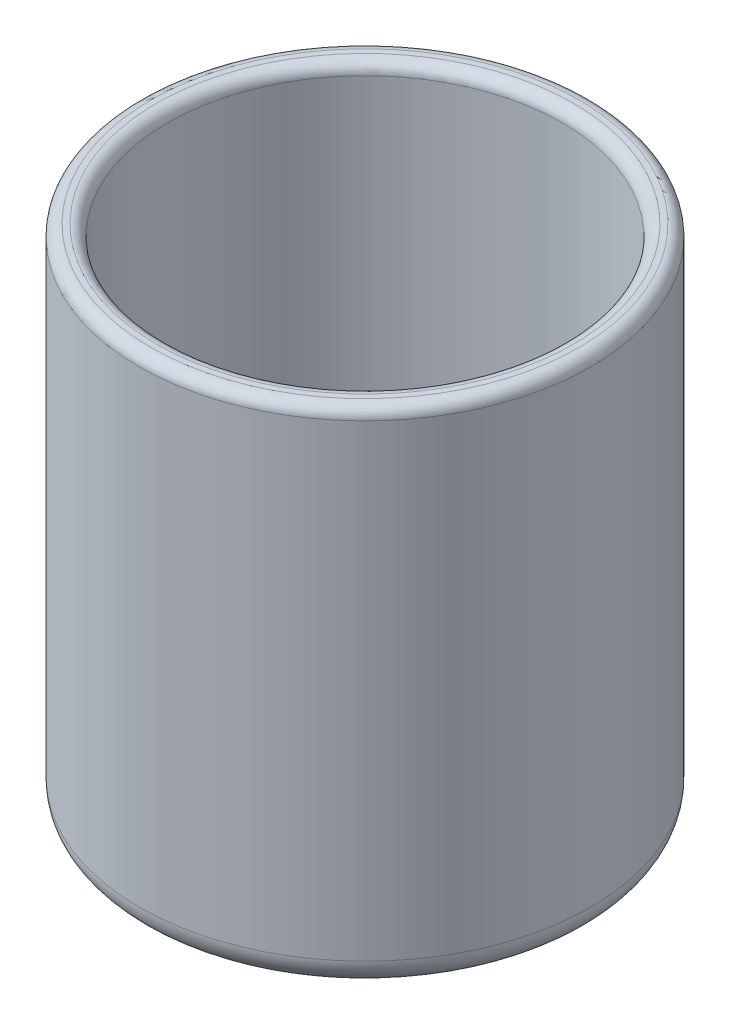
ISO-10303-21;
HEADER;
FILE_DESCRIPTION(('STEP AP214'),'2;1');
FILE_NAME('part.step','',(''),(''),'','','');
FILE_SCHEMA(('AUTOMOTIVE_DESIGN { 1 0 10303 214 1 1 1 1 }'));
ENDSEC;
DATA;
#1=APPLICATION_CONTEXT('core data for automotive mechanical design processes');
#2=APPLICATION_PROTOCOL_DEFINITION('international standard','automotive_design',2000,#1);
#3=PRODUCT_CONTEXT('',#1,'mechanical');
#4=PRODUCT('Part','Part','',(#3));
#5=PRODUCT_RELATED_PRODUCT_CATEGORY('part','',(#4));
#6=PRODUCT_DEFINITION_FORMATION('','',#4);
#7=PRODUCT_DEFINITION_CONTEXT('part definition',#1,'design');
#8=PRODUCT_DEFINITION('design','',#6,#7);
#9=PRODUCT_DEFINITION_SHAPE('','',#8);
#10=(LENGTH_UNIT() NAMED_UNIT(*) SI_UNIT(.MILLI.,.METRE.));
#11=(NAMED_UNIT(*) PLANE_ANGLE_UNIT() SI_UNIT($,.RADIAN.));
#12=(NAMED_UNIT(*) SI_UNIT($,.STERADIAN.) SOLID_ANGLE_UNIT());
#13=UNCERTAINTY_MEASURE_WITH_UNIT(LENGTH_MEASURE(1.E-05),#10,'distance_accuracy_value','');
#14=(GEOMETRIC_REPRESENTATION_CONTEXT(3) GLOBAL_UNCERTAINTY_ASSIGNED_CONTEXT((#13)) GLOBAL_UNIT_ASSIGNED_CONTEXT((#10,
#11,#12)) REPRESENTATION_CONTEXT('',''));
#15=CARTESIAN_POINT('',(0.,0.,0.));
#16=DIRECTION('',(0.,0.,1.));
#17=DIRECTION('',(1.,0.,0.));
#18=AXIS2_PLACEMENT_3D('',#15,#16,#17);
#19=CARTESIAN_POINT('',(0.,90.,0.));
#20=DIRECTION('',(0.,-1.,0.));
#21=DIRECTION('',(0.,0.,-1.));
#22=AXIS2_PLACEMENT_3D('',#19,#20,#21);
#23=CYLINDRICAL_SURFACE('',#22,40.);
#24=CARTESIAN_POINT('',(0.,5.,0.));
#25=DIRECTION('',(0.,1.,0.));
#26=DIRECTION('',(0.,0.,1.));
#27=AXIS2_PLACEMENT_3D('',#24,#25,#26);
#28=CIRCLE('',#27,40.);
#29=CARTESIAN_POINT('',(0.,4.99999999999999,-40.));
#30=VERTEX_POINT('',#29);
#31=EDGE_CURVE('E39',#30,#30,#28,.T.);
#32=CARTESIAN_POINT('',(0.,88.,0.));
#33=DIRECTION('',(0.,1.,0.));
#34=DIRECTION('',(0.,0.,1.));
#35=AXIS2_PLACEMENT_3D('',#32,#33,#34);
#36=CIRCLE('',#35,40.);
#37=CARTESIAN_POINT('',(0.,88.,-40.));
#38=VERTEX_POINT('',#37);
#39=EDGE_CURVE('E55',#38,#38,#36,.F.);
#40=CARTESIAN_POINT('',(0.,4.99999999999999,-40.));
#41=CARTESIAN_POINT('',(0.,5.86458333333333,-40.));
#42=CARTESIAN_POINT('',(0.,6.72916666666666,-40.));
#43=CARTESIAN_POINT('',(0.,8.45833333333333,-40.));
#44=CARTESIAN_POINT('',(0.,9.32291666666666,-40.));
#45=CARTESIAN_POINT('',(0.,11.0520833333333,-40.));
#46=CARTESIAN_POINT('',(0.,11.9166666666667,-40.));
#47=CARTESIAN_POINT('',(0.,13.6458333333333,-40.));
#48=CARTESIAN_POINT('',(0.,14.5104166666667,-40.));
#49=CARTESIAN_POINT('',(0.,16.2395833333333,-40.));
#50=CARTESIAN_POINT('',(0.,17.1041666666667,-40.));
#51=CARTESIAN_POINT('',(0.,18.8333333333333,-40.));
#52=CARTESIAN_POINT('',(0.,19.6979166666667,-40.));
#53=CARTESIAN_POINT('',(0.,21.4270833333333,-40.));
#54=CARTESIAN_POINT('',(0.,22.2916666666667,-40.));
#55=CARTESIAN_POINT('',(0.,24.0208333333333,-40.));
#56=CARTESIAN_POINT('',(0.,24.8854166666667,-40.));
#57=CARTESIAN_POINT('',(0.,26.6145833333333,-40.));
#58=CARTESIAN_POINT('',(0.,27.4791666666667,-40.));
#59=CARTESIAN_POINT('',(0.,29.2083333333333,-40.));
#60=CARTESIAN_POINT('',(0.,30.0729166666667,-40.));
#61=CARTESIAN_POINT('',(0.,31.8020833333333,-40.));
#62=CARTESIAN_POINT('',(0.,32.6666666666667,-40.));
#63=CARTESIAN_POINT('',(0.,34.3958333333333,-40.));
#64=CARTESIAN_POINT('',(0.,35.2604166666667,-40.));
#65=CARTESIAN_POINT('',(0.,36.9895833333333,-40.));
#66=CARTESIAN_POINT('',(0.,37.8541666666667,-40.));
#67=CARTESIAN_POINT('',(0.,39.5833333333333,-40.));
#68=CARTESIAN_POINT('',(0.,40.4479166666667,-40.));
#69=CARTESIAN_POINT('',(0.,42.1770833333333,-40.));
#70=CARTESIAN_POINT('',(0.,43.0416666666667,-40.));
#71=CARTESIAN_POINT('',(0.,44.7708333333333,-40.));
#72=CARTESIAN_POINT('',(0.,45.6354166666667,-40.));
#73=CARTESIAN_POINT('',(0.,47.3645833333333,-40.));
#74=CARTESIAN_POINT('',(0.,48.2291666666667,-40.));
#75=CARTESIAN_POINT('',(0.,49.9583333333333,-40.));
#76=CARTESIAN_POINT('',(0.,50.8229166666667,-40.));
#77=CARTESIAN_POINT('',(0.,52.5520833333333,-40.));
#78=CARTESIAN_POINT('',(0.,53.4166666666667,-40.));
#79=CARTESIAN_POINT('',(0.,55.1458333333333,-40.));
#80=CARTESIAN_POINT('',(0.,56.0104166666667,-40.));
#81=CARTESIAN_POINT('',(0.,57.7395833333333,-40.));
#82=CARTESIAN_POINT('',(0.,58.6041666666667,-40.));
#83=CARTESIAN_POINT('',(0.,60.3333333333333,-40.));
#84=CARTESIAN_POINT('',(0.,61.1979166666667,-40.));
#85=CARTESIAN_POINT('',(0.,62.9270833333333,-40.));
#86=CARTESIAN_POINT('',(0.,63.7916666666667,-40.));
#87=CARTESIAN_POINT('',(0.,65.5208333333333,-40.));
#88=CARTESIAN_POINT('',(0.,66.3854166666666,-40.));
#89=CARTESIAN_POINT('',(0.,68.1145833333333,-40.));
#90=CARTESIAN_POINT('',(0.,68.9791666666666,-40.));
#91=CARTESIAN_POINT('',(0.,70.7083333333333,-40.));
#92=CARTESIAN_POINT('',(0.,71.5729166666666,-40.));
#93=CARTESIAN_POINT('',(0.,73.3020833333333,-40.));
#94=CARTESIAN_POINT('',(0.,74.1666666666666,-40.));
#95=CARTESIAN_POINT('',(0.,75.8958333333333,-40.));
#96=CARTESIAN_POINT('',(0.,76.7604166666667,-40.));
#97=CARTESIAN_POINT('',(0.,78.4895833333333,-40.));
#98=CARTESIAN_POINT('',(0.,79.3541666666666,-40.));
#99=CARTESIAN_POINT('',(0.,81.0833333333333,-40.));
#100=CARTESIAN_POINT('',(0.,81.9479166666666,-40.));
#101=CARTESIAN_POINT('',(0.,83.6770833333333,-40.));
#102=CARTESIAN_POINT('',(0.,84.5416666666666,-40.));
#103=CARTESIAN_POINT('',(0.,86.2708333333333,-40.));
#104=CARTESIAN_POINT('',(0.,87.1354166666666,-40.));
#105=CARTESIAN_POINT('',(0.,88.,-40.));
#106=B_SPLINE_CURVE_WITH_KNOTS('',3,(#40,#41,#42,#43,#44,#45,#46,#47,#48,#49,#50,#51,#52,#53,
#54,#55,#56,#57,#58,#59,#60,#61,#62,#63,#64,#65,#66,#67,#68,#69,#70,#71,#72,#73,#74,#75,#76,#77,
#78,#79,#80,#81,#82,#83,#84,#85,#86,#87,#88,#89,#90,#91,#92,#93,#94,#95,#96,#97,#98,#99,#100,
#101,#102,#103,#104,#105),.UNSPECIFIED.,.F.,.F.,(4,2,2,2,2,2,2,2,2,2,2,2,2,2,2,2,2,2,2,2,2,2,2,
2,2,2,2,2,2,2,2,2,4),(0.,2.59375000000001,5.1875,7.78125,10.375,12.96875,15.5625,18.15625,20.75,
23.34375,25.9375,28.53125,31.125,33.71875,36.3125,38.90625,41.5,44.09375,46.6875,49.28125,
51.875,54.46875,57.0625,59.65625,62.25,64.84375,67.4375,70.03125,72.625,75.21875,77.8125,
80.40625,83.),.UNSPECIFIED.);
#107=EDGE_CURVE('BSEAM32',#30,#38,#106,.T.);
#108=ORIENTED_EDGE('',*,*,#31,.T.);
#109=ORIENTED_EDGE('',*,*,#39,.T.);
#110=ORIENTED_EDGE('',*,*,#107,.T.);
#111=ORIENTED_EDGE('',*,*,#107,.F.);
#112=EDGE_LOOP('',(#108,#110,#109,#111));
#113=FACE_BOUND('',#112,.T.);
#114=ADVANCED_FACE('F32',(#113),#23,.T.);
#115=CARTESIAN_POINT('',(0.,90.,0.));
#116=DIRECTION('',(0.,1.,0.));
#117=DIRECTION('',(0.,0.,1.));
#118=AXIS2_PLACEMENT_3D('',#115,#116,#117);
#119=PLANE('',#118);
#120=CARTESIAN_POINT('',(0.,90.,0.));
#121=DIRECTION('',(0.,1.,0.));
#122=DIRECTION('',(0.,0.,1.));
#123=AXIS2_PLACEMENT_3D('',#120,#121,#122);
#124=CIRCLE('',#123,38.);
#125=CARTESIAN_POINT('',(0.,90.,38.));
#126=VERTEX_POINT('',#125);
#127=EDGE_CURVE('E58',#126,#126,#124,.T.);
#128=ORIENTED_EDGE('',*,*,#127,.T.);
#129=EDGE_LOOP('',(#128));
#130=FACE_BOUND('',#129,.T.);
#131=CARTESIAN_POINT('',(0.,90.,0.));
#132=DIRECTION('',(0.,1.,0.));
#133=DIRECTION('',(0.,0.,1.));
#134=AXIS2_PLACEMENT_3D('',#131,#132,#133);
#135=CIRCLE('',#134,37.);
#136=CARTESIAN_POINT('',(0.,90.,37.));
#137=VERTEX_POINT('',#136);
#138=EDGE_CURVE('E61',#137,#137,#135,.F.);
#139=ORIENTED_EDGE('',*,*,#138,.T.);
#140=EDGE_LOOP('',(#139));
#141=FACE_BOUND('',#140,.T.);
#142=ADVANCED_FACE('F65',(#130,#141),#119,.T.);
#143=CARTESIAN_POINT('',(0.,0.,0.));
#144=DIRECTION('',(0.,1.,0.));
#145=DIRECTION('',(0.,0.,1.));
#146=AXIS2_PLACEMENT_3D('',#143,#144,#145);
#147=PLANE('',#146);
#148=CARTESIAN_POINT('',(0.,0.,0.));
#149=DIRECTION('',(0.,1.,0.));
#150=DIRECTION('',(0.,0.,1.));
#151=AXIS2_PLACEMENT_3D('',#148,#149,#150);
#152=CIRCLE('',#151,35.);
#153=CARTESIAN_POINT('',(0.,0.,35.));
#154=VERTEX_POINT('',#153);
#155=EDGE_CURVE('E10',#154,#154,#152,.F.);
#156=ORIENTED_EDGE('',*,*,#155,.T.);
#157=EDGE_LOOP('',(#156));
#158=FACE_BOUND('',#157,.T.);
#159=ADVANCED_FACE('F78',(#158),#147,.F.);
#160=CARTESIAN_POINT('',(0.,4.99999999999999,0.));
#161=DIRECTION('',(0.,1.,0.));
#162=DIRECTION('',(0.,0.,1.));
#163=AXIS2_PLACEMENT_3D('',#160,#161,#162);
#164=CYLINDRICAL_SURFACE('',#163,35.);
#165=CARTESIAN_POINT('',(0.,9.99999999999999,0.));
#166=DIRECTION('',(0.,1.,0.));
#167=DIRECTION('',(0.,0.,1.));
#168=AXIS2_PLACEMENT_3D('',#165,#166,#167);
#169=CIRCLE('',#168,35.);
#170=CARTESIAN_POINT('',(0.,9.99999999999999,35.));
#171=VERTEX_POINT('',#170);
#172=EDGE_CURVE('E43',#171,#171,#169,.F.);
#173=ORIENTED_EDGE('',*,*,#172,.T.);
#174=EDGE_LOOP('',(#173));
#175=FACE_BOUND('',#174,.T.);
#176=CARTESIAN_POINT('',(0.,88.,0.));
#177=DIRECTION('',(0.,1.,0.));
#178=DIRECTION('',(0.,0.,1.));
#179=AXIS2_PLACEMENT_3D('',#176,#177,#178);
#180=CIRCLE('',#179,35.);
#181=CARTESIAN_POINT('',(0.,88.,35.));
#182=VERTEX_POINT('',#181);
#183=EDGE_CURVE('E52',#182,#182,#180,.T.);
#184=ORIENTED_EDGE('',*,*,#183,.T.);
#185=EDGE_LOOP('',(#184));
#186=FACE_BOUND('',#185,.T.);
#187=ADVANCED_FACE('F75',(#175,#186),#164,.F.);
#188=CARTESIAN_POINT('',(0.,4.99999999999999,0.));
#189=DIRECTION('',(0.,1.,0.));
#190=DIRECTION('',(0.,0.,1.));
#191=AXIS2_PLACEMENT_3D('',#188,#189,#190);
#192=PLANE('',#191);
#193=CARTESIAN_POINT('',(0.,4.99999999999999,0.));
#194=DIRECTION('',(0.,1.,0.));
#195=DIRECTION('',(0.,0.,1.));
#196=AXIS2_PLACEMENT_3D('',#193,#194,#195);
#197=CIRCLE('',#196,30.);
#198=CARTESIAN_POINT('',(0.,4.99999999999999,30.));
#199=VERTEX_POINT('',#198);
#200=EDGE_CURVE('E47',#199,#199,#197,.T.);
#201=ORIENTED_EDGE('',*,*,#200,.T.);
#202=EDGE_LOOP('',(#201));
#203=FACE_BOUND('',#202,.T.);
#204=ADVANCED_FACE('F77',(#203),#192,.T.);
#205=CARTESIAN_POINT('',(0.,88.,0.));
#206=DIRECTION('',(0.,1.,0.));
#207=DIRECTION('',(0.,0.,1.));
#208=AXIS2_PLACEMENT_3D('',#205,#206,#207);
#209=TOROIDAL_SURFACE('',#208,38.,2.);
#210=ORIENTED_EDGE('',*,*,#39,.F.);
#211=EDGE_LOOP('',(#210));
#212=FACE_BOUND('',#211,.T.);
#213=ORIENTED_EDGE('',*,*,#127,.F.);
#214=EDGE_LOOP('',(#213));
#215=FACE_BOUND('',#214,.T.);
#216=ADVANCED_FACE('F71',(#212,#215),#209,.T.);
#217=CARTESIAN_POINT('',(0.,88.,0.));
#218=DIRECTION('',(0.,1.,0.));
#219=DIRECTION('',(0.,0.,1.));
#220=AXIS2_PLACEMENT_3D('',#217,#218,#219);
#221=TOROIDAL_SURFACE('',#220,37.,2.);
#222=ORIENTED_EDGE('',*,*,#138,.F.);
#223=EDGE_LOOP('',(#222));
#224=FACE_BOUND('',#223,.T.);
#225=ORIENTED_EDGE('',*,*,#183,.F.);
#226=EDGE_LOOP('',(#225));
#227=FACE_BOUND('',#226,.T.);
#228=ADVANCED_FACE('F67',(#224,#227),#221,.T.);
#229=CARTESIAN_POINT('',(0.,9.99999999999999,0.));
#230=DIRECTION('',(0.,1.,0.));
#231=DIRECTION('',(0.,0.,1.));
#232=AXIS2_PLACEMENT_3D('',#229,#230,#231);
#233=TOROIDAL_SURFACE('',#232,30.,5.);
#234=ORIENTED_EDGE('',*,*,#172,.F.);
#235=EDGE_LOOP('',(#234));
#236=FACE_BOUND('',#235,.T.);
#237=ORIENTED_EDGE('',*,*,#200,.F.);
#238=EDGE_LOOP('',(#237));
#239=FACE_BOUND('',#238,.T.);
#240=ADVANCED_FACE('F70',(#236,#239),#233,.F.);
#241=CARTESIAN_POINT('',(0.,5.,0.));
#242=DIRECTION('',(0.,1.,0.));
#243=DIRECTION('',(0.,0.,1.));
#244=AXIS2_PLACEMENT_3D('',#241,#242,#243);
#245=TOROIDAL_SURFACE('',#244,35.,5.);
#246=ORIENTED_EDGE('',*,*,#155,.F.);
#247=EDGE_LOOP('',(#246));
#248=FACE_BOUND('',#247,.T.);
#249=ORIENTED_EDGE('',*,*,#31,.F.);
#250=EDGE_LOOP('',(#249));
#251=FACE_BOUND('',#250,.T.);
#252=ADVANCED_FACE('F34',(#248,#251),#245,.T.);
#253=CLOSED_SHELL('',(#114,#142,#159,#187,#204,#216,#228,#240,#252));
#254=MANIFOLD_SOLID_BREP('B2',#253);
#255=ADVANCED_BREP_SHAPE_REPRESENTATION('',(#18,#254),#14);
#256=SHAPE_DEFINITION_REPRESENTATION(#9,#255);
ENDSEC;
END-ISO-10303-21;
